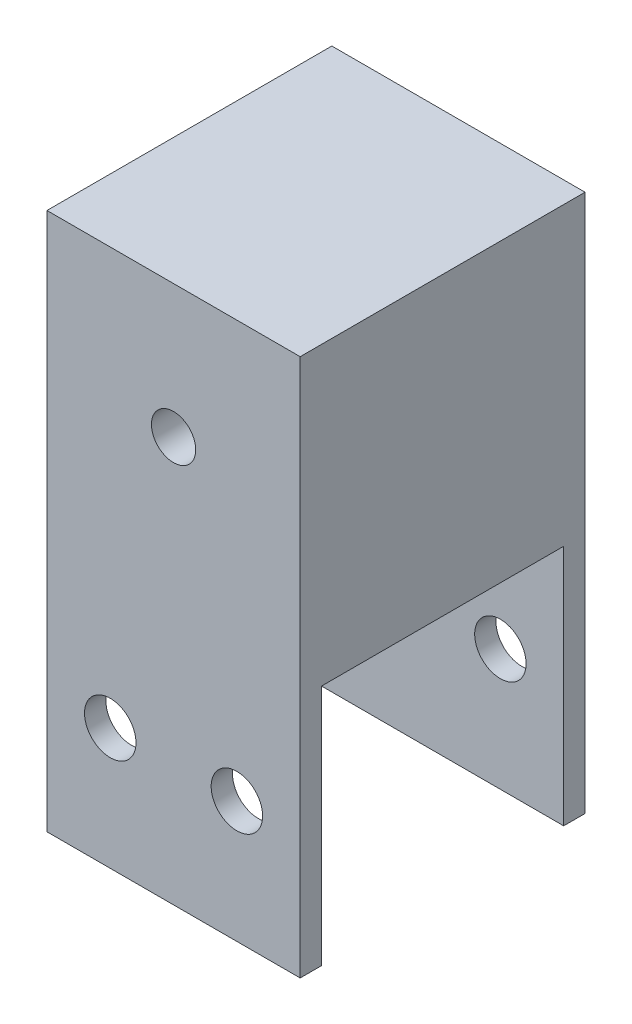
ISO-10303-21;
HEADER;
FILE_DESCRIPTION(('STEP AP214'),'2;1');
FILE_NAME('part.step','',(''),(''),'','','');
FILE_SCHEMA(('AUTOMOTIVE_DESIGN { 1 0 10303 214 1 1 1 1 }'));
ENDSEC;
DATA;
#1=APPLICATION_CONTEXT('core data for automotive mechanical design processes');
#2=APPLICATION_PROTOCOL_DEFINITION('international standard','automotive_design',2000,#1);
#3=PRODUCT_CONTEXT('',#1,'mechanical');
#4=PRODUCT('Part','Part','',(#3));
#5=PRODUCT_RELATED_PRODUCT_CATEGORY('part','',(#4));
#6=PRODUCT_DEFINITION_FORMATION('','',#4);
#7=PRODUCT_DEFINITION_CONTEXT('part definition',#1,'design');
#8=PRODUCT_DEFINITION('design','',#6,#7);
#9=PRODUCT_DEFINITION_SHAPE('','',#8);
#10=(LENGTH_UNIT() NAMED_UNIT(*) SI_UNIT(.MILLI.,.METRE.));
#11=(NAMED_UNIT(*) PLANE_ANGLE_UNIT() SI_UNIT($,.RADIAN.));
#12=(NAMED_UNIT(*) SI_UNIT($,.STERADIAN.) SOLID_ANGLE_UNIT());
#13=UNCERTAINTY_MEASURE_WITH_UNIT(LENGTH_MEASURE(1.E-05),#10,'distance_accuracy_value','');
#14=(GEOMETRIC_REPRESENTATION_CONTEXT(3) GLOBAL_UNCERTAINTY_ASSIGNED_CONTEXT((#13)) GLOBAL_UNIT_ASSIGNED_CONTEXT((#10,
#11,#12)) REPRESENTATION_CONTEXT('',''));
#15=CARTESIAN_POINT('',(0.,0.,0.));
#16=DIRECTION('',(0.,0.,1.));
#17=DIRECTION('',(1.,0.,0.));
#18=AXIS2_PLACEMENT_3D('',#15,#16,#17);
#19=CARTESIAN_POINT('',(0.,0.,45.));
#20=DIRECTION('',(0.,1.,0.));
#21=DIRECTION('',(0.,0.,1.));
#22=AXIS2_PLACEMENT_3D('',#19,#20,#21);
#23=PLANE('',#22);
#24=DIRECTION('',(0.,0.,-1.));
#25=VECTOR('',#24,1.);
#26=CARTESIAN_POINT('',(0.,0.,45.));
#27=LINE('',#26,#25);
#28=CARTESIAN_POINT('',(0.,0.,45.));
#29=VERTEX_POINT('',#28);
#30=CARTESIAN_POINT('',(0.,0.,41.625));
#31=VERTEX_POINT('',#30);
#32=EDGE_CURVE('E42',#29,#31,#27,.T.);
#33=ORIENTED_EDGE('',*,*,#32,.T.);
#34=DIRECTION('',(1.,0.,0.));
#35=VECTOR('',#34,1.);
#36=CARTESIAN_POINT('',(0.,0.,41.625));
#37=LINE('',#36,#35);
#38=CARTESIAN_POINT('',(40.,0.,41.625));
#39=VERTEX_POINT('',#38);
#40=EDGE_CURVE('E110',#31,#39,#37,.T.);
#41=ORIENTED_EDGE('',*,*,#40,.T.);
#42=DIRECTION('',(0.,0.,-1.));
#43=VECTOR('',#42,1.);
#44=CARTESIAN_POINT('',(40.,0.,45.));
#45=LINE('',#44,#43);
#46=CARTESIAN_POINT('',(40.,0.,45.));
#47=VERTEX_POINT('',#46);
#48=EDGE_CURVE('E130',#47,#39,#45,.T.);
#49=ORIENTED_EDGE('',*,*,#48,.F.);
#50=DIRECTION('',(1.,0.,0.));
#51=VECTOR('',#50,1.);
#52=CARTESIAN_POINT('',(0.,0.,45.));
#53=LINE('',#52,#51);
#54=EDGE_CURVE('E87',#29,#47,#53,.T.);
#55=ORIENTED_EDGE('',*,*,#54,.F.);
#56=EDGE_LOOP('',(#33,#41,#49,#55));
#57=FACE_BOUND('',#56,.T.);
#58=ADVANCED_FACE('F34',(#57),#23,.F.);
#59=CARTESIAN_POINT('',(0.,0.,45.));
#60=DIRECTION('',(1.,0.,0.));
#61=DIRECTION('',(0.,1.,0.));
#62=AXIS2_PLACEMENT_3D('',#59,#60,#61);
#63=PLANE('',#62);
#64=DIRECTION('',(0.,0.,1.));
#65=VECTOR('',#64,1.);
#66=CARTESIAN_POINT('',(0.,38.25,41.625));
#67=LINE('',#66,#65);
#68=CARTESIAN_POINT('',(0.,38.25,3.375));
#69=VERTEX_POINT('',#68);
#70=CARTESIAN_POINT('',(0.,38.25,41.625));
#71=VERTEX_POINT('',#70);
#72=EDGE_CURVE('E118',#69,#71,#67,.T.);
#73=ORIENTED_EDGE('',*,*,#72,.T.);
#74=DIRECTION('',(0.,-1.,0.));
#75=VECTOR('',#74,1.);
#76=CARTESIAN_POINT('',(0.,0.,41.625));
#77=LINE('',#76,#75);
#78=EDGE_CURVE('E113',#71,#31,#77,.T.);
#79=ORIENTED_EDGE('',*,*,#78,.T.);
#80=ORIENTED_EDGE('',*,*,#32,.F.);
#81=DIRECTION('',(0.,-1.,0.));
#82=VECTOR('',#81,1.);
#83=CARTESIAN_POINT('',(0.,0.,45.));
#84=LINE('',#83,#82);
#85=CARTESIAN_POINT('',(0.,85.,45.));
#86=VERTEX_POINT('',#85);
#87=EDGE_CURVE('E166',#86,#29,#84,.T.);
#88=ORIENTED_EDGE('',*,*,#87,.F.);
#89=DIRECTION('',(0.,0.,-1.));
#90=VECTOR('',#89,1.);
#91=CARTESIAN_POINT('',(0.,85.,45.));
#92=LINE('',#91,#90);
#93=CARTESIAN_POINT('',(0.,85.,0.));
#94=VERTEX_POINT('',#93);
#95=EDGE_CURVE('E172',#86,#94,#92,.T.);
#96=ORIENTED_EDGE('',*,*,#95,.T.);
#97=DIRECTION('',(0.,-1.,0.));
#98=VECTOR('',#97,1.);
#99=CARTESIAN_POINT('',(0.,0.,0.));
#100=LINE('',#99,#98);
#101=CARTESIAN_POINT('',(0.,0.,0.));
#102=VERTEX_POINT('',#101);
#103=EDGE_CURVE('E162',#94,#102,#100,.T.);
#104=ORIENTED_EDGE('',*,*,#103,.T.);
#105=CARTESIAN_POINT('',(0.,0.,3.375));
#106=VERTEX_POINT('',#105);
#107=EDGE_CURVE('E128',#106,#102,#27,.T.);
#108=ORIENTED_EDGE('',*,*,#107,.F.);
#109=DIRECTION('',(0.,1.,0.));
#110=VECTOR('',#109,1.);
#111=CARTESIAN_POINT('',(0.,0.,3.375));
#112=LINE('',#111,#110);
#113=EDGE_CURVE('E125',#106,#69,#112,.T.);
#114=ORIENTED_EDGE('',*,*,#113,.T.);
#115=EDGE_LOOP('',(#73,#79,#80,#88,#96,#104,#108,#114));
#116=FACE_BOUND('',#115,.T.);
#117=ADVANCED_FACE('F36',(#116),#63,.F.);
#118=CARTESIAN_POINT('',(40.,0.,3.37500000000001));
#119=VERTEX_POINT('',#118);
#120=CARTESIAN_POINT('',(40.,0.,0.));
#121=VERTEX_POINT('',#120);
#122=EDGE_CURVE('E182',#119,#121,#45,.T.);
#123=ORIENTED_EDGE('',*,*,#122,.F.);
#124=DIRECTION('',(1.,0.,0.));
#125=VECTOR('',#124,1.);
#126=CARTESIAN_POINT('',(0.,0.,3.375));
#127=LINE('',#126,#125);
#128=EDGE_CURVE('E49',#106,#119,#127,.T.);
#129=ORIENTED_EDGE('',*,*,#128,.F.);
#130=ORIENTED_EDGE('',*,*,#107,.T.);
#131=DIRECTION('',(1.,0.,0.));
#132=VECTOR('',#131,1.);
#133=CARTESIAN_POINT('',(0.,0.,0.));
#134=LINE('',#133,#132);
#135=EDGE_CURVE('E175',#102,#121,#134,.T.);
#136=ORIENTED_EDGE('',*,*,#135,.T.);
#137=EDGE_LOOP('',(#123,#129,#130,#136));
#138=FACE_BOUND('',#137,.T.);
#139=ADVANCED_FACE('F197',(#138),#23,.F.);
#140=CARTESIAN_POINT('',(40.,0.,45.));
#141=DIRECTION('',(-1.,0.,0.));
#142=DIRECTION('',(0.,-1.,0.));
#143=AXIS2_PLACEMENT_3D('',#140,#141,#142);
#144=PLANE('',#143);
#145=ORIENTED_EDGE('',*,*,#48,.T.);
#146=DIRECTION('',(0.,-1.,0.));
#147=VECTOR('',#146,1.);
#148=CARTESIAN_POINT('',(40.,0.,41.625));
#149=LINE('',#148,#147);
#150=CARTESIAN_POINT('',(40.,38.25,41.625));
#151=VERTEX_POINT('',#150);
#152=EDGE_CURVE('E116',#151,#39,#149,.T.);
#153=ORIENTED_EDGE('',*,*,#152,.F.);
#154=DIRECTION('',(0.,0.,1.));
#155=VECTOR('',#154,1.);
#156=CARTESIAN_POINT('',(40.,38.25,41.625));
#157=LINE('',#156,#155);
#158=CARTESIAN_POINT('',(40.,38.25,3.375));
#159=VERTEX_POINT('',#158);
#160=EDGE_CURVE('E126',#159,#151,#157,.T.);
#161=ORIENTED_EDGE('',*,*,#160,.F.);
#162=DIRECTION('',(0.,1.,0.));
#163=VECTOR('',#162,1.);
#164=CARTESIAN_POINT('',(40.,0.,3.375));
#165=LINE('',#164,#163);
#166=EDGE_CURVE('E156',#119,#159,#165,.T.);
#167=ORIENTED_EDGE('',*,*,#166,.F.);
#168=ORIENTED_EDGE('',*,*,#122,.T.);
#169=DIRECTION('',(0.,1.,0.));
#170=VECTOR('',#169,1.);
#171=CARTESIAN_POINT('',(40.,0.,0.));
#172=LINE('',#171,#170);
#173=CARTESIAN_POINT('',(40.,85.,0.));
#174=VERTEX_POINT('',#173);
#175=EDGE_CURVE('E178',#121,#174,#172,.T.);
#176=ORIENTED_EDGE('',*,*,#175,.T.);
#177=DIRECTION('',(0.,0.,-1.));
#178=VECTOR('',#177,1.);
#179=CARTESIAN_POINT('',(40.,85.,45.));
#180=LINE('',#179,#178);
#181=CARTESIAN_POINT('',(40.,85.,45.));
#182=VERTEX_POINT('',#181);
#183=EDGE_CURVE('E181',#182,#174,#180,.T.);
#184=ORIENTED_EDGE('',*,*,#183,.F.);
#185=DIRECTION('',(0.,1.,0.));
#186=VECTOR('',#185,1.);
#187=CARTESIAN_POINT('',(40.,0.,45.));
#188=LINE('',#187,#186);
#189=EDGE_CURVE('E169',#47,#182,#188,.T.);
#190=ORIENTED_EDGE('',*,*,#189,.F.);
#191=EDGE_LOOP('',(#145,#153,#161,#167,#168,#176,#184,#190));
#192=FACE_BOUND('',#191,.T.);
#193=ADVANCED_FACE('F187',(#192),#144,.F.);
#194=CARTESIAN_POINT('',(0.,85.,45.));
#195=DIRECTION('',(0.,-1.,0.));
#196=DIRECTION('',(0.,0.,-1.));
#197=AXIS2_PLACEMENT_3D('',#194,#195,#196);
#198=PLANE('',#197);
#199=DIRECTION('',(-1.,0.,0.));
#200=VECTOR('',#199,1.);
#201=CARTESIAN_POINT('',(0.,85.,0.));
#202=LINE('',#201,#200);
#203=EDGE_CURVE('E79',#174,#94,#202,.T.);
#204=ORIENTED_EDGE('',*,*,#203,.T.);
#205=ORIENTED_EDGE('',*,*,#95,.F.);
#206=DIRECTION('',(-1.,0.,0.));
#207=VECTOR('',#206,1.);
#208=CARTESIAN_POINT('',(0.,85.,45.));
#209=LINE('',#208,#207);
#210=EDGE_CURVE('E58',#182,#86,#209,.T.);
#211=ORIENTED_EDGE('',*,*,#210,.F.);
#212=ORIENTED_EDGE('',*,*,#183,.T.);
#213=EDGE_LOOP('',(#204,#205,#211,#212));
#214=FACE_BOUND('',#213,.T.);
#215=ADVANCED_FACE('F221',(#214),#198,.F.);
#216=CARTESIAN_POINT('',(0.,0.,45.));
#217=DIRECTION('',(0.,0.,-1.));
#218=DIRECTION('',(-1.,0.,0.));
#219=AXIS2_PLACEMENT_3D('',#216,#217,#218);
#220=PLANE('',#219);
#221=CARTESIAN_POINT('',(20.,64.,45.));
#222=DIRECTION('',(0.,0.,-1.));
#223=DIRECTION('',(-1.,0.,0.));
#224=AXIS2_PLACEMENT_3D('',#221,#222,#223);
#225=CIRCLE('',#224,3.5);
#226=CARTESIAN_POINT('',(16.5,64.,45.));
#227=VERTEX_POINT('',#226);
#228=EDGE_CURVE('E237',#227,#227,#225,.T.);
#229=ORIENTED_EDGE('',*,*,#228,.T.);
#230=EDGE_LOOP('',(#229));
#231=FACE_BOUND('',#230,.T.);
#232=CARTESIAN_POINT('',(30.,19.2,45.));
#233=DIRECTION('',(0.,0.,-1.));
#234=DIRECTION('',(-1.,0.,0.));
#235=AXIS2_PLACEMENT_3D('',#232,#233,#234);
#236=CIRCLE('',#235,4.065);
#237=CARTESIAN_POINT('',(25.935,19.2,45.));
#238=VERTEX_POINT('',#237);
#239=EDGE_CURVE('E137',#238,#238,#236,.T.);
#240=ORIENTED_EDGE('',*,*,#239,.T.);
#241=EDGE_LOOP('',(#240));
#242=FACE_BOUND('',#241,.T.);
#243=CARTESIAN_POINT('',(10.,19.2,45.));
#244=DIRECTION('',(0.,0.,-1.));
#245=DIRECTION('',(-1.,0.,0.));
#246=AXIS2_PLACEMENT_3D('',#243,#244,#245);
#247=CIRCLE('',#246,4.065);
#248=CARTESIAN_POINT('',(5.935,19.2,45.));
#249=VERTEX_POINT('',#248);
#250=EDGE_CURVE('E150',#249,#249,#247,.T.);
#251=ORIENTED_EDGE('',*,*,#250,.T.);
#252=EDGE_LOOP('',(#251));
#253=FACE_BOUND('',#252,.T.);
#254=ORIENTED_EDGE('',*,*,#87,.T.);
#255=ORIENTED_EDGE('',*,*,#54,.T.);
#256=ORIENTED_EDGE('',*,*,#189,.T.);
#257=ORIENTED_EDGE('',*,*,#210,.T.);
#258=EDGE_LOOP('',(#254,#255,#256,#257));
#259=FACE_BOUND('',#258,.T.);
#260=ADVANCED_FACE('F189',(#231,#242,#253,#259),#220,.F.);
#261=CARTESIAN_POINT('',(0.,0.,0.));
#262=DIRECTION('',(0.,0.,-1.));
#263=DIRECTION('',(-1.,0.,0.));
#264=AXIS2_PLACEMENT_3D('',#261,#262,#263);
#265=PLANE('',#264);
#266=CARTESIAN_POINT('',(20.,64.,0.));
#267=DIRECTION('',(0.,0.,-1.));
#268=DIRECTION('',(-1.,0.,0.));
#269=AXIS2_PLACEMENT_3D('',#266,#267,#268);
#270=CIRCLE('',#269,6.675);
#271=CARTESIAN_POINT('',(13.325,64.,0.));
#272=VERTEX_POINT('',#271);
#273=EDGE_CURVE('E11',#272,#272,#270,.T.);
#274=ORIENTED_EDGE('',*,*,#273,.F.);
#275=EDGE_LOOP('',(#274));
#276=FACE_BOUND('',#275,.T.);
#277=CARTESIAN_POINT('',(30.,19.2,0.));
#278=DIRECTION('',(0.,0.,-1.));
#279=DIRECTION('',(-1.,0.,0.));
#280=AXIS2_PLACEMENT_3D('',#277,#278,#279);
#281=CIRCLE('',#280,4.065);
#282=CARTESIAN_POINT('',(25.935,19.2,0.));
#283=VERTEX_POINT('',#282);
#284=EDGE_CURVE('E244',#283,#283,#281,.T.);
#285=ORIENTED_EDGE('',*,*,#284,.F.);
#286=EDGE_LOOP('',(#285));
#287=FACE_BOUND('',#286,.T.);
#288=CARTESIAN_POINT('',(10.,19.2,0.));
#289=DIRECTION('',(0.,0.,-1.));
#290=DIRECTION('',(-1.,0.,0.));
#291=AXIS2_PLACEMENT_3D('',#288,#289,#290);
#292=CIRCLE('',#291,4.065);
#293=CARTESIAN_POINT('',(5.935,19.2,0.));
#294=VERTEX_POINT('',#293);
#295=EDGE_CURVE('E245',#294,#294,#292,.T.);
#296=ORIENTED_EDGE('',*,*,#295,.F.);
#297=EDGE_LOOP('',(#296));
#298=FACE_BOUND('',#297,.T.);
#299=ORIENTED_EDGE('',*,*,#103,.F.);
#300=ORIENTED_EDGE('',*,*,#203,.F.);
#301=ORIENTED_EDGE('',*,*,#175,.F.);
#302=ORIENTED_EDGE('',*,*,#135,.F.);
#303=EDGE_LOOP('',(#299,#300,#301,#302));
#304=FACE_BOUND('',#303,.T.);
#305=ADVANCED_FACE('F194',(#276,#287,#298,#304),#265,.T.);
#306=CARTESIAN_POINT('',(0.,0.,41.625));
#307=DIRECTION('',(0.,0.,1.));
#308=DIRECTION('',(1.,0.,0.));
#309=AXIS2_PLACEMENT_3D('',#306,#307,#308);
#310=PLANE('',#309);
#311=CARTESIAN_POINT('',(30.,19.2,41.625));
#312=DIRECTION('',(0.,0.,1.));
#313=DIRECTION('',(1.,0.,0.));
#314=AXIS2_PLACEMENT_3D('',#311,#312,#313);
#315=CIRCLE('',#314,4.065);
#316=CARTESIAN_POINT('',(34.065,19.2,41.625));
#317=VERTEX_POINT('',#316);
#318=EDGE_CURVE('E140',#317,#317,#315,.T.);
#319=ORIENTED_EDGE('',*,*,#318,.T.);
#320=EDGE_LOOP('',(#319));
#321=FACE_BOUND('',#320,.T.);
#322=CARTESIAN_POINT('',(10.,19.2,41.625));
#323=DIRECTION('',(0.,0.,1.));
#324=DIRECTION('',(1.,0.,0.));
#325=AXIS2_PLACEMENT_3D('',#322,#323,#324);
#326=CIRCLE('',#325,4.065);
#327=CARTESIAN_POINT('',(14.065,19.2,41.625));
#328=VERTEX_POINT('',#327);
#329=EDGE_CURVE('E136',#328,#328,#326,.T.);
#330=ORIENTED_EDGE('',*,*,#329,.T.);
#331=EDGE_LOOP('',(#330));
#332=FACE_BOUND('',#331,.T.);
#333=ORIENTED_EDGE('',*,*,#152,.T.);
#334=ORIENTED_EDGE('',*,*,#40,.F.);
#335=ORIENTED_EDGE('',*,*,#78,.F.);
#336=DIRECTION('',(1.,0.,0.));
#337=VECTOR('',#336,1.);
#338=CARTESIAN_POINT('',(0.,38.25,41.625));
#339=LINE('',#338,#337);
#340=EDGE_CURVE('E160',#71,#151,#339,.T.);
#341=ORIENTED_EDGE('',*,*,#340,.T.);
#342=EDGE_LOOP('',(#333,#334,#335,#341));
#343=FACE_BOUND('',#342,.T.);
#344=ADVANCED_FACE('F112',(#321,#332,#343),#310,.F.);
#345=CARTESIAN_POINT('',(0.,38.25,41.625));
#346=DIRECTION('',(0.,1.,0.));
#347=DIRECTION('',(-1.,0.,0.));
#348=AXIS2_PLACEMENT_3D('',#345,#346,#347);
#349=PLANE('',#348);
#350=ORIENTED_EDGE('',*,*,#160,.T.);
#351=ORIENTED_EDGE('',*,*,#340,.F.);
#352=ORIENTED_EDGE('',*,*,#72,.F.);
#353=DIRECTION('',(1.,0.,0.));
#354=VECTOR('',#353,1.);
#355=CARTESIAN_POINT('',(0.,38.25,3.375));
#356=LINE('',#355,#354);
#357=EDGE_CURVE('E163',#69,#159,#356,.T.);
#358=ORIENTED_EDGE('',*,*,#357,.T.);
#359=EDGE_LOOP('',(#350,#351,#352,#358));
#360=FACE_BOUND('',#359,.T.);
#361=ADVANCED_FACE('F200',(#360),#349,.F.);
#362=CARTESIAN_POINT('',(0.,0.,3.375));
#363=DIRECTION('',(0.,0.,-1.));
#364=DIRECTION('',(-1.,0.,0.));
#365=AXIS2_PLACEMENT_3D('',#362,#363,#364);
#366=PLANE('',#365);
#367=CARTESIAN_POINT('',(30.,19.2,3.375));
#368=DIRECTION('',(0.,0.,-1.));
#369=DIRECTION('',(-1.,0.,0.));
#370=AXIS2_PLACEMENT_3D('',#367,#368,#369);
#371=CIRCLE('',#370,4.065);
#372=CARTESIAN_POINT('',(25.935,19.2,3.375));
#373=VERTEX_POINT('',#372);
#374=EDGE_CURVE('E138',#373,#373,#371,.T.);
#375=ORIENTED_EDGE('',*,*,#374,.T.);
#376=EDGE_LOOP('',(#375));
#377=FACE_BOUND('',#376,.T.);
#378=CARTESIAN_POINT('',(10.,19.2,3.375));
#379=DIRECTION('',(0.,0.,-1.));
#380=DIRECTION('',(-1.,0.,0.));
#381=AXIS2_PLACEMENT_3D('',#378,#379,#380);
#382=CIRCLE('',#381,4.065);
#383=CARTESIAN_POINT('',(5.935,19.2,3.375));
#384=VERTEX_POINT('',#383);
#385=EDGE_CURVE('E134',#384,#384,#382,.T.);
#386=ORIENTED_EDGE('',*,*,#385,.T.);
#387=EDGE_LOOP('',(#386));
#388=FACE_BOUND('',#387,.T.);
#389=ORIENTED_EDGE('',*,*,#166,.T.);
#390=ORIENTED_EDGE('',*,*,#357,.F.);
#391=ORIENTED_EDGE('',*,*,#113,.F.);
#392=ORIENTED_EDGE('',*,*,#128,.T.);
#393=EDGE_LOOP('',(#389,#390,#391,#392));
#394=FACE_BOUND('',#393,.T.);
#395=ADVANCED_FACE('F198',(#377,#388,#394),#366,.F.);
#396=CARTESIAN_POINT('',(10.,19.2,45.));
#397=DIRECTION('',(0.,0.,-1.));
#398=DIRECTION('',(-1.,0.,0.));
#399=AXIS2_PLACEMENT_3D('',#396,#397,#398);
#400=CYLINDRICAL_SURFACE('',#399,4.065);
#401=ORIENTED_EDGE('',*,*,#295,.T.);
#402=EDGE_LOOP('',(#401));
#403=FACE_BOUND('',#402,.T.);
#404=ORIENTED_EDGE('',*,*,#385,.F.);
#405=EDGE_LOOP('',(#404));
#406=FACE_BOUND('',#405,.T.);
#407=ADVANCED_FACE('F207',(#403,#406),#400,.F.);
#408=CARTESIAN_POINT('',(30.,19.2,45.));
#409=DIRECTION('',(0.,0.,-1.));
#410=DIRECTION('',(-1.,0.,0.));
#411=AXIS2_PLACEMENT_3D('',#408,#409,#410);
#412=CYLINDRICAL_SURFACE('',#411,4.065);
#413=ORIENTED_EDGE('',*,*,#284,.T.);
#414=EDGE_LOOP('',(#413));
#415=FACE_BOUND('',#414,.T.);
#416=ORIENTED_EDGE('',*,*,#374,.F.);
#417=EDGE_LOOP('',(#416));
#418=FACE_BOUND('',#417,.T.);
#419=ADVANCED_FACE('F279',(#415,#418),#412,.F.);
#420=ORIENTED_EDGE('',*,*,#250,.F.);
#421=EDGE_LOOP('',(#420));
#422=FACE_BOUND('',#421,.T.);
#423=ORIENTED_EDGE('',*,*,#329,.F.);
#424=EDGE_LOOP('',(#423));
#425=FACE_BOUND('',#424,.T.);
#426=ADVANCED_FACE('F282',(#422,#425),#400,.F.);
#427=ORIENTED_EDGE('',*,*,#239,.F.);
#428=EDGE_LOOP('',(#427));
#429=FACE_BOUND('',#428,.T.);
#430=ORIENTED_EDGE('',*,*,#318,.F.);
#431=EDGE_LOOP('',(#430));
#432=FACE_BOUND('',#431,.T.);
#433=ADVANCED_FACE('F272',(#429,#432),#412,.F.);
#434=CARTESIAN_POINT('',(20.,64.,-5.));
#435=DIRECTION('',(0.,0.,1.));
#436=DIRECTION('',(1.,0.,0.));
#437=AXIS2_PLACEMENT_3D('',#434,#435,#436);
#438=CYLINDRICAL_SURFACE('',#437,6.675);
#439=CARTESIAN_POINT('',(20.,64.,-5.));
#440=DIRECTION('',(0.,0.,1.));
#441=DIRECTION('',(1.,0.,0.));
#442=AXIS2_PLACEMENT_3D('',#439,#440,#441);
#443=CIRCLE('',#442,6.675);
#444=CARTESIAN_POINT('',(26.675,64.,-5.));
#445=VERTEX_POINT('',#444);
#446=EDGE_CURVE('E249',#445,#445,#443,.T.);
#447=ORIENTED_EDGE('',*,*,#446,.T.);
#448=EDGE_LOOP('',(#447));
#449=FACE_BOUND('',#448,.T.);
#450=ORIENTED_EDGE('',*,*,#273,.T.);
#451=EDGE_LOOP('',(#450));
#452=FACE_BOUND('',#451,.T.);
#453=ADVANCED_FACE('F266',(#449,#452),#438,.T.);
#454=CARTESIAN_POINT('',(20.,64.,-5.));
#455=DIRECTION('',(0.,0.,1.));
#456=DIRECTION('',(1.,0.,0.));
#457=AXIS2_PLACEMENT_3D('',#454,#455,#456);
#458=PLANE('',#457);
#459=CARTESIAN_POINT('',(20.,64.,-5.));
#460=DIRECTION('',(0.,0.,-1.));
#461=DIRECTION('',(-1.,0.,0.));
#462=AXIS2_PLACEMENT_3D('',#459,#460,#461);
#463=CIRCLE('',#462,3.5);
#464=CARTESIAN_POINT('',(16.5,64.,-5.));
#465=VERTEX_POINT('',#464);
#466=EDGE_CURVE('E257',#465,#465,#463,.T.);
#467=ORIENTED_EDGE('',*,*,#466,.F.);
#468=EDGE_LOOP('',(#467));
#469=FACE_BOUND('',#468,.T.);
#470=ORIENTED_EDGE('',*,*,#446,.F.);
#471=EDGE_LOOP('',(#470));
#472=FACE_BOUND('',#471,.T.);
#473=ADVANCED_FACE('F263',(#469,#472),#458,.F.);
#474=CARTESIAN_POINT('',(20.,64.,45.));
#475=DIRECTION('',(0.,0.,-1.));
#476=DIRECTION('',(-1.,0.,0.));
#477=AXIS2_PLACEMENT_3D('',#474,#475,#476);
#478=CYLINDRICAL_SURFACE('',#477,3.5);
#479=CARTESIAN_POINT('',(16.5,64.,45.));
#480=CARTESIAN_POINT('',(16.5,64.,44.4791666666667));
#481=CARTESIAN_POINT('',(16.5,64.,43.9583333333333));
#482=CARTESIAN_POINT('',(16.5,64.,42.9166666666667));
#483=CARTESIAN_POINT('',(16.5,64.,42.3958333333333));
#484=CARTESIAN_POINT('',(16.5,64.,41.3541666666667));
#485=CARTESIAN_POINT('',(16.5,64.,40.8333333333333));
#486=CARTESIAN_POINT('',(16.5,64.,39.7916666666667));
#487=CARTESIAN_POINT('',(16.5,64.,39.2708333333333));
#488=CARTESIAN_POINT('',(16.5,64.,38.2291666666667));
#489=CARTESIAN_POINT('',(16.5,64.,37.7083333333333));
#490=CARTESIAN_POINT('',(16.5,64.,36.6666666666667));
#491=CARTESIAN_POINT('',(16.5,64.,36.1458333333333));
#492=CARTESIAN_POINT('',(16.5,64.,35.1041666666667));
#493=CARTESIAN_POINT('',(16.5,64.,34.5833333333333));
#494=CARTESIAN_POINT('',(16.5,64.,33.5416666666667));
#495=CARTESIAN_POINT('',(16.5,64.,33.0208333333333));
#496=CARTESIAN_POINT('',(16.5,64.,31.9791666666667));
#497=CARTESIAN_POINT('',(16.5,64.,31.4583333333333));
#498=CARTESIAN_POINT('',(16.5,64.,30.4166666666667));
#499=CARTESIAN_POINT('',(16.5,64.,29.8958333333333));
#500=CARTESIAN_POINT('',(16.5,64.,28.8541666666667));
#501=CARTESIAN_POINT('',(16.5,64.,28.3333333333333));
#502=CARTESIAN_POINT('',(16.5,64.,27.2916666666667));
#503=CARTESIAN_POINT('',(16.5,64.,26.7708333333333));
#504=CARTESIAN_POINT('',(16.5,64.,25.7291666666667));
#505=CARTESIAN_POINT('',(16.5,64.,25.2083333333333));
#506=CARTESIAN_POINT('',(16.5,64.,24.1666666666667));
#507=CARTESIAN_POINT('',(16.5,64.,23.6458333333333));
#508=CARTESIAN_POINT('',(16.5,64.,22.6041666666667));
#509=CARTESIAN_POINT('',(16.5,64.,22.0833333333333));
#510=CARTESIAN_POINT('',(16.5,64.,21.0416666666667));
#511=CARTESIAN_POINT('',(16.5,64.,20.5208333333333));
#512=CARTESIAN_POINT('',(16.5,64.,19.4791666666667));
#513=CARTESIAN_POINT('',(16.5,64.,18.9583333333333));
#514=CARTESIAN_POINT('',(16.5,64.,17.9166666666667));
#515=CARTESIAN_POINT('',(16.5,64.,17.3958333333333));
#516=CARTESIAN_POINT('',(16.5,64.,16.3541666666667));
#517=CARTESIAN_POINT('',(16.5,64.,15.8333333333333));
#518=CARTESIAN_POINT('',(16.5,64.,14.7916666666667));
#519=CARTESIAN_POINT('',(16.5,64.,14.2708333333333));
#520=CARTESIAN_POINT('',(16.5,64.,13.2291666666667));
#521=CARTESIAN_POINT('',(16.5,64.,12.7083333333333));
#522=CARTESIAN_POINT('',(16.5,64.,11.6666666666667));
#523=CARTESIAN_POINT('',(16.5,64.,11.1458333333333));
#524=CARTESIAN_POINT('',(16.5,64.,10.1041666666667));
#525=CARTESIAN_POINT('',(16.5,64.,9.58333333333333));
#526=CARTESIAN_POINT('',(16.5,64.,8.54166666666667));
#527=CARTESIAN_POINT('',(16.5,64.,8.02083333333333));
#528=CARTESIAN_POINT('',(16.5,64.,6.97916666666667));
#529=CARTESIAN_POINT('',(16.5,64.,6.45833333333334));
#530=CARTESIAN_POINT('',(16.5,64.,5.41666666666667));
#531=CARTESIAN_POINT('',(16.5,64.,4.89583333333334));
#532=CARTESIAN_POINT('',(16.5,64.,3.85416666666667));
#533=CARTESIAN_POINT('',(16.5,64.,3.33333333333334));
#534=CARTESIAN_POINT('',(16.5,64.,2.29166666666667));
#535=CARTESIAN_POINT('',(16.5,64.,1.77083333333333));
#536=CARTESIAN_POINT('',(16.5,64.,0.729166666666667));
#537=CARTESIAN_POINT('',(16.5,64.,0.208333333333333));
#538=CARTESIAN_POINT('',(16.5,64.,-0.833333333333332));
#539=CARTESIAN_POINT('',(16.5,64.,-1.35416666666666));
#540=CARTESIAN_POINT('',(16.5,64.,-2.39583333333333));
#541=CARTESIAN_POINT('',(16.5,64.,-2.91666666666666));
#542=CARTESIAN_POINT('',(16.5,64.,-3.95833333333333));
#543=CARTESIAN_POINT('',(16.5,64.,-4.47916666666666));
#544=CARTESIAN_POINT('',(16.5,64.,-5.));
#545=B_SPLINE_CURVE_WITH_KNOTS('',3,(#479,#480,#481,#482,#483,#484,#485,#486,#487,#488,#489,
#490,#491,#492,#493,#494,#495,#496,#497,#498,#499,#500,#501,#502,#503,#504,#505,#506,#507,#508,
#509,#510,#511,#512,#513,#514,#515,#516,#517,#518,#519,#520,#521,#522,#523,#524,#525,#526,#527,
#528,#529,#530,#531,#532,#533,#534,#535,#536,#537,#538,#539,#540,#541,#542,#543,#544),
.UNSPECIFIED.,.F.,.F.,(4,2,2,2,2,2,2,2,2,2,2,2,2,2,2,2,2,2,2,2,2,2,2,2,2,2,2,2,2,2,2,2,4),(0.,
1.56249999999999,3.125,4.6875,6.25,7.81249999999999,9.37499999999999,10.9375,12.5,14.0625,
15.625,17.1875,18.75,20.3125,21.875,23.4375,25.,26.5625,28.125,29.6875,31.25,32.8125,34.375,
35.9375,37.5,39.0625,40.625,42.1875,43.75,45.3125,46.875,48.4375,50.),.UNSPECIFIED.);
#546=EDGE_CURVE('BSEAM261',#227,#465,#545,.T.);
#547=ORIENTED_EDGE('',*,*,#228,.F.);
#548=ORIENTED_EDGE('',*,*,#466,.T.);
#549=ORIENTED_EDGE('',*,*,#546,.T.);
#550=ORIENTED_EDGE('',*,*,#546,.F.);
#551=EDGE_LOOP('',(#547,#549,#548,#550));
#552=FACE_BOUND('',#551,.T.);
#553=ADVANCED_FACE('F261',(#552),#478,.F.);
#554=CLOSED_SHELL('',(#58,#117,#139,#193,#215,#260,#305,#344,#361,#395,#407,#419,#426,#433,#453,
#473,#553));
#555=MANIFOLD_SOLID_BREP('B2',#554);
#556=ADVANCED_BREP_SHAPE_REPRESENTATION('',(#18,#555),#14);
#557=SHAPE_DEFINITION_REPRESENTATION(#9,#556);
ENDSEC;
END-ISO-10303-21;
